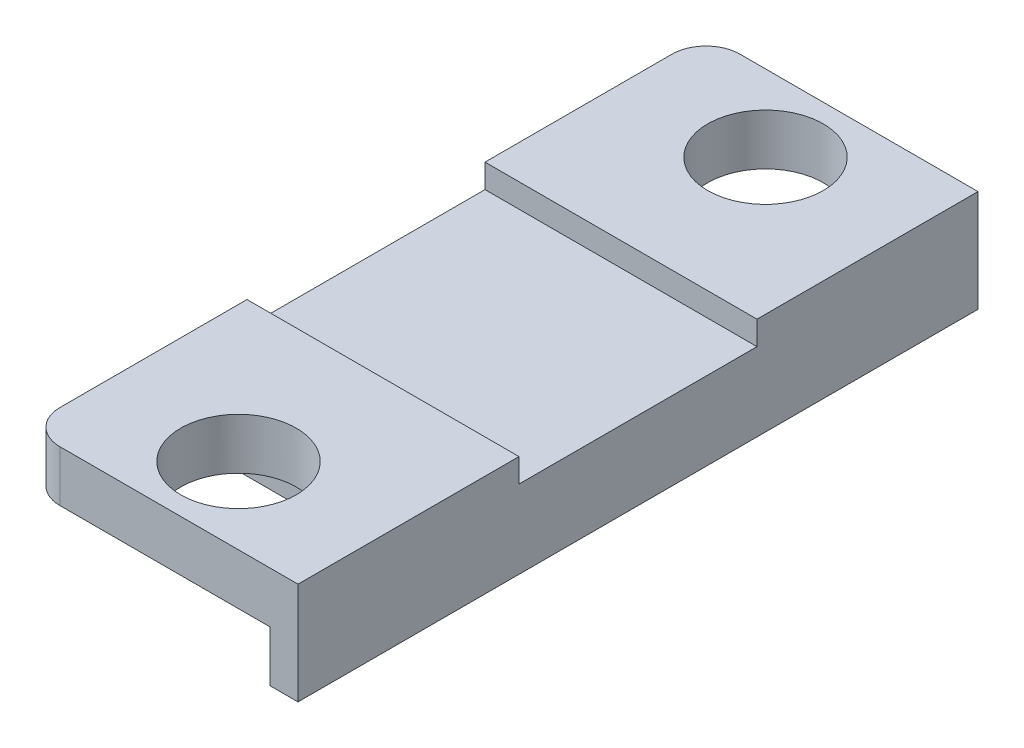
ISO-10303-21;
HEADER;
FILE_DESCRIPTION(('STEP AP214'),'2;1');
FILE_NAME('part.step','',(''),(''),'','','');
FILE_SCHEMA(('AUTOMOTIVE_DESIGN { 1 0 10303 214 1 1 1 1 }'));
ENDSEC;
DATA;
#1=APPLICATION_CONTEXT('core data for automotive mechanical design processes');
#2=APPLICATION_PROTOCOL_DEFINITION('international standard','automotive_design',2000,#1);
#3=PRODUCT_CONTEXT('',#1,'mechanical');
#4=PRODUCT('Part','Part','',(#3));
#5=PRODUCT_RELATED_PRODUCT_CATEGORY('part','',(#4));
#6=PRODUCT_DEFINITION_FORMATION('','',#4);
#7=PRODUCT_DEFINITION_CONTEXT('part definition',#1,'design');
#8=PRODUCT_DEFINITION('design','',#6,#7);
#9=PRODUCT_DEFINITION_SHAPE('','',#8);
#10=(LENGTH_UNIT() NAMED_UNIT(*) SI_UNIT(.MILLI.,.METRE.));
#11=(NAMED_UNIT(*) PLANE_ANGLE_UNIT() SI_UNIT($,.RADIAN.));
#12=(NAMED_UNIT(*) SI_UNIT($,.STERADIAN.) SOLID_ANGLE_UNIT());
#13=UNCERTAINTY_MEASURE_WITH_UNIT(LENGTH_MEASURE(1.E-05),#10,'distance_accuracy_value','');
#14=(GEOMETRIC_REPRESENTATION_CONTEXT(3) GLOBAL_UNCERTAINTY_ASSIGNED_CONTEXT((#13)) GLOBAL_UNIT_ASSIGNED_CONTEXT((#10,
#11,#12)) REPRESENTATION_CONTEXT('',''));
#15=CARTESIAN_POINT('',(0.,0.,0.));
#16=DIRECTION('',(0.,0.,1.));
#17=DIRECTION('',(1.,0.,0.));
#18=AXIS2_PLACEMENT_3D('',#15,#16,#17);
#19=CARTESIAN_POINT('',(169.963302832178,-1.,15.4999987760664));
#20=DIRECTION('',(0.,0.,1.));
#21=DIRECTION('',(1.,0.,0.));
#22=AXIS2_PLACEMENT_3D('',#19,#20,#21);
#23=PLANE('',#22);
#24=DIRECTION('',(1.,0.,0.));
#25=VECTOR('',#24,1.);
#26=CARTESIAN_POINT('',(169.962302832178,-0.7,15.4999987760664));
#27=LINE('',#26,#25);
#28=CARTESIAN_POINT('',(161.962302832178,-0.7,15.4999987760664));
#29=VERTEX_POINT('',#28);
#30=CARTESIAN_POINT('',(169.962302832178,-0.7,15.4999987760664));
#31=VERTEX_POINT('',#30);
#32=EDGE_CURVE('E54',#29,#31,#27,.T.);
#33=ORIENTED_EDGE('',*,*,#32,.F.);
#34=DIRECTION('',(0.,1.,0.));
#35=VECTOR('',#34,1.);
#36=CARTESIAN_POINT('',(161.962302832178,-1.,15.4999987760664));
#37=LINE('',#36,#35);
#38=CARTESIAN_POINT('',(161.962302832178,0.,15.4999987760664));
#39=VERTEX_POINT('',#38);
#40=EDGE_CURVE('E174',#29,#39,#37,.T.);
#41=ORIENTED_EDGE('',*,*,#40,.T.);
#42=DIRECTION('',(-1.,0.,0.));
#43=VECTOR('',#42,1.);
#44=CARTESIAN_POINT('',(169.963302832178,0.,15.4999987760664));
#45=LINE('',#44,#43);
#46=CARTESIAN_POINT('',(169.962302832178,0.,15.4999987760664));
#47=VERTEX_POINT('',#46);
#48=EDGE_CURVE('E173',#47,#39,#45,.T.);
#49=ORIENTED_EDGE('',*,*,#48,.F.);
#50=DIRECTION('',(0.,1.,0.));
#51=VECTOR('',#50,1.);
#52=CARTESIAN_POINT('',(169.962302832178,-1.,15.4999987760664));
#53=LINE('',#52,#51);
#54=EDGE_CURVE('E50',#31,#47,#53,.T.);
#55=ORIENTED_EDGE('',*,*,#54,.F.);
#56=EDGE_LOOP('',(#33,#41,#49,#55));
#57=FACE_BOUND('',#56,.T.);
#58=ADVANCED_FACE('F35',(#57),#23,.F.);
#59=CARTESIAN_POINT('',(169.963302832178,-1.,8.49999877606639));
#60=DIRECTION('',(0.,0.,-1.));
#61=DIRECTION('',(-1.,0.,0.));
#62=AXIS2_PLACEMENT_3D('',#59,#60,#61);
#63=PLANE('',#62);
#64=DIRECTION('',(-1.,0.,0.));
#65=VECTOR('',#64,1.);
#66=CARTESIAN_POINT('',(169.962302832178,-0.7,8.49999877606639));
#67=LINE('',#66,#65);
#68=CARTESIAN_POINT('',(169.962302832178,-0.7,8.49999877606639));
#69=VERTEX_POINT('',#68);
#70=CARTESIAN_POINT('',(161.962302832178,-0.7,8.49999877606639));
#71=VERTEX_POINT('',#70);
#72=EDGE_CURVE('E166',#69,#71,#67,.T.);
#73=ORIENTED_EDGE('',*,*,#72,.F.);
#74=DIRECTION('',(0.,-1.,0.));
#75=VECTOR('',#74,1.);
#76=CARTESIAN_POINT('',(169.962302832178,-1.,8.49999877606639));
#77=LINE('',#76,#75);
#78=CARTESIAN_POINT('',(169.962302832178,0.,8.49999877606639));
#79=VERTEX_POINT('',#78);
#80=EDGE_CURVE('E187',#79,#69,#77,.T.);
#81=ORIENTED_EDGE('',*,*,#80,.F.);
#82=DIRECTION('',(-1.,0.,0.));
#83=VECTOR('',#82,1.);
#84=CARTESIAN_POINT('',(169.963302832178,0.,8.49999877606639));
#85=LINE('',#84,#83);
#86=CARTESIAN_POINT('',(161.962302832178,0.,8.49999877606639));
#87=VERTEX_POINT('',#86);
#88=EDGE_CURVE('E169',#79,#87,#85,.T.);
#89=ORIENTED_EDGE('',*,*,#88,.T.);
#90=DIRECTION('',(0.,-1.,0.));
#91=VECTOR('',#90,1.);
#92=CARTESIAN_POINT('',(161.962302832178,-1.,8.49999877606639));
#93=LINE('',#92,#91);
#94=EDGE_CURVE('E163',#87,#71,#93,.T.);
#95=ORIENTED_EDGE('',*,*,#94,.T.);
#96=EDGE_LOOP('',(#73,#81,#89,#95));
#97=FACE_BOUND('',#96,.T.);
#98=ADVANCED_FACE('F165',(#97),#63,.F.);
#99=CARTESIAN_POINT('',(0.,0.,0.));
#100=DIRECTION('',(0.,1.,0.));
#101=DIRECTION('',(0.,0.,1.));
#102=AXIS2_PLACEMENT_3D('',#99,#100,#101);
#103=PLANE('',#102);
#104=DIRECTION('',(0.,0.,1.));
#105=VECTOR('',#104,1.);
#106=CARTESIAN_POINT('',(161.962302832178,0.,1.99999877606639));
#107=LINE('',#106,#105);
#108=CARTESIAN_POINT('',(161.962302832178,0.,20.9999987760664));
#109=VERTEX_POINT('',#108);
#110=EDGE_CURVE('E267',#39,#109,#107,.T.);
#111=ORIENTED_EDGE('',*,*,#110,.T.);
#112=CARTESIAN_POINT('',(162.962302832178,0.,20.9999987760664));
#113=DIRECTION('',(0.,1.,0.));
#114=DIRECTION('',(0.,0.,1.));
#115=AXIS2_PLACEMENT_3D('',#112,#113,#114);
#116=CIRCLE('',#115,1.);
#117=CARTESIAN_POINT('',(162.962302832178,0.,21.9999987760664));
#118=VERTEX_POINT('',#117);
#119=EDGE_CURVE('E318',#109,#118,#116,.T.);
#120=ORIENTED_EDGE('',*,*,#119,.T.);
#121=DIRECTION('',(1.,0.,0.));
#122=VECTOR('',#121,1.);
#123=CARTESIAN_POINT('',(161.962302832178,0.,21.9999987760664));
#124=LINE('',#123,#122);
#125=CARTESIAN_POINT('',(169.962302832178,0.,21.9999987760664));
#126=VERTEX_POINT('',#125);
#127=EDGE_CURVE('E280',#118,#126,#124,.T.);
#128=ORIENTED_EDGE('',*,*,#127,.T.);
#129=DIRECTION('',(0.,0.,-1.));
#130=VECTOR('',#129,1.);
#131=CARTESIAN_POINT('',(169.962302832178,0.,1.99999877606639));
#132=LINE('',#131,#130);
#133=EDGE_CURVE('E283',#126,#47,#132,.T.);
#134=ORIENTED_EDGE('',*,*,#133,.T.);
#135=ORIENTED_EDGE('',*,*,#48,.T.);
#136=EDGE_LOOP('',(#111,#120,#128,#134,#135));
#137=FACE_BOUND('',#136,.T.);
#138=CARTESIAN_POINT('',(165.962302832178,0.,19.75));
#139=DIRECTION('',(0.,1.,0.));
#140=DIRECTION('',(0.,0.,1.));
#141=AXIS2_PLACEMENT_3D('',#138,#139,#140);
#142=CIRCLE('',#141,1.70000000000001);
#143=CARTESIAN_POINT('',(165.962302832178,0.,21.45));
#144=VERTEX_POINT('',#143);
#145=EDGE_CURVE('E261',#144,#144,#142,.T.);
#146=ORIENTED_EDGE('',*,*,#145,.F.);
#147=EDGE_LOOP('',(#146));
#148=FACE_BOUND('',#147,.T.);
#149=ADVANCED_FACE('F335',(#137,#148),#103,.T.);
#150=CARTESIAN_POINT('',(165.962302832178,-3.,19.75));
#151=DIRECTION('',(0.,1.,0.));
#152=DIRECTION('',(0.,0.,1.));
#153=AXIS2_PLACEMENT_3D('',#150,#151,#152);
#154=CYLINDRICAL_SURFACE('',#153,1.70000000000001);
#155=ORIENTED_EDGE('',*,*,#145,.T.);
#156=EDGE_LOOP('',(#155));
#157=FACE_BOUND('',#156,.T.);
#158=CARTESIAN_POINT('',(165.962302832178,-1.5,19.75));
#159=DIRECTION('',(0.,-1.,0.));
#160=DIRECTION('',(0.,0.,-1.));
#161=AXIS2_PLACEMENT_3D('',#158,#159,#160);
#162=CIRCLE('',#161,1.70000000000001);
#163=CARTESIAN_POINT('',(165.962302832178,-1.5,18.05));
#164=VERTEX_POINT('',#163);
#165=EDGE_CURVE('E253',#164,#164,#162,.F.);
#166=ORIENTED_EDGE('',*,*,#165,.F.);
#167=EDGE_LOOP('',(#166));
#168=FACE_BOUND('',#167,.T.);
#169=ADVANCED_FACE('F378',(#157,#168),#154,.F.);
#170=CARTESIAN_POINT('',(161.962302832178,-3.,1.99999877606639));
#171=DIRECTION('',(-1.,0.,0.));
#172=DIRECTION('',(0.,0.,1.));
#173=AXIS2_PLACEMENT_3D('',#170,#171,#172);
#174=PLANE('',#173);
#175=ORIENTED_EDGE('',*,*,#40,.F.);
#176=DIRECTION('',(0.,0.,1.));
#177=VECTOR('',#176,1.);
#178=CARTESIAN_POINT('',(161.962302832178,-0.7,8.49999877606639));
#179=LINE('',#178,#177);
#180=EDGE_CURVE('E180',#71,#29,#179,.T.);
#181=ORIENTED_EDGE('',*,*,#180,.F.);
#182=ORIENTED_EDGE('',*,*,#94,.F.);
#183=CARTESIAN_POINT('',(161.962302832178,0.,2.99999877606639));
#184=VERTEX_POINT('',#183);
#185=EDGE_CURVE('E278',#184,#87,#107,.T.);
#186=ORIENTED_EDGE('',*,*,#185,.F.);
#187=DIRECTION('',(0.,1.,0.));
#188=VECTOR('',#187,1.);
#189=CARTESIAN_POINT('',(161.962302832178,-3.,2.99999877606639));
#190=LINE('',#189,#188);
#191=CARTESIAN_POINT('',(161.962302832178,-1.5,2.99999877606639));
#192=VERTEX_POINT('',#191);
#193=EDGE_CURVE('E300',#184,#192,#190,.F.);
#194=ORIENTED_EDGE('',*,*,#193,.T.);
#195=DIRECTION('',(0.,0.,-1.));
#196=VECTOR('',#195,1.);
#197=CARTESIAN_POINT('',(161.962302832178,-1.5,1.99999877606639));
#198=LINE('',#197,#196);
#199=CARTESIAN_POINT('',(161.962302832178,-1.5,6.99999755213277));
#200=VERTEX_POINT('',#199);
#201=EDGE_CURVE('E204',#200,#192,#198,.T.);
#202=ORIENTED_EDGE('',*,*,#201,.F.);
#203=DIRECTION('',(0.,-1.,0.));
#204=VECTOR('',#203,1.);
#205=CARTESIAN_POINT('',(161.962302832178,-1.5,6.99999755213277));
#206=LINE('',#205,#204);
#207=CARTESIAN_POINT('',(161.962302832178,-2.,6.99999755213277));
#208=VERTEX_POINT('',#207);
#209=EDGE_CURVE('E224',#200,#208,#206,.T.);
#210=ORIENTED_EDGE('',*,*,#209,.T.);
#211=DIRECTION('',(0.,0.,1.));
#212=VECTOR('',#211,1.);
#213=CARTESIAN_POINT('',(161.962302832178,-2.,17.));
#214=LINE('',#213,#212);
#215=CARTESIAN_POINT('',(161.962302832178,-2.,17.));
#216=VERTEX_POINT('',#215);
#217=EDGE_CURVE('E302',#208,#216,#214,.T.);
#218=ORIENTED_EDGE('',*,*,#217,.T.);
#219=DIRECTION('',(0.,-1.,0.));
#220=VECTOR('',#219,1.);
#221=CARTESIAN_POINT('',(161.962302832178,-1.5,17.));
#222=LINE('',#221,#220);
#223=CARTESIAN_POINT('',(161.962302832178,-1.5,17.));
#224=VERTEX_POINT('',#223);
#225=EDGE_CURVE('E250',#224,#216,#222,.T.);
#226=ORIENTED_EDGE('',*,*,#225,.F.);
#227=DIRECTION('',(0.,0.,-1.));
#228=VECTOR('',#227,1.);
#229=CARTESIAN_POINT('',(161.962302832178,-1.5,21.9999987760664));
#230=LINE('',#229,#228);
#231=CARTESIAN_POINT('',(161.962302832178,-1.5,20.9999987760664));
#232=VERTEX_POINT('',#231);
#233=EDGE_CURVE('E241',#232,#224,#230,.T.);
#234=ORIENTED_EDGE('',*,*,#233,.F.);
#235=DIRECTION('',(0.,1.,0.));
#236=VECTOR('',#235,1.);
#237=CARTESIAN_POINT('',(161.962302832178,-3.,20.9999987760664));
#238=LINE('',#237,#236);
#239=EDGE_CURVE('E291',#232,#109,#238,.T.);
#240=ORIENTED_EDGE('',*,*,#239,.T.);
#241=ORIENTED_EDGE('',*,*,#110,.F.);
#242=EDGE_LOOP('',(#175,#181,#182,#186,#194,#202,#210,#218,#226,#234,#240,#241));
#243=FACE_BOUND('',#242,.T.);
#244=ADVANCED_FACE('F184',(#243),#174,.T.);
#245=CARTESIAN_POINT('',(161.962302832178,-3.,1.99999877606639));
#246=DIRECTION('',(0.,0.,-1.));
#247=DIRECTION('',(-1.,0.,0.));
#248=AXIS2_PLACEMENT_3D('',#245,#246,#247);
#249=PLANE('',#248);
#250=DIRECTION('',(1.,0.,0.));
#251=VECTOR('',#250,1.);
#252=CARTESIAN_POINT('',(169.137729312721,-1.5,1.99999877606639));
#253=LINE('',#252,#251);
#254=CARTESIAN_POINT('',(162.962302832178,-1.5,1.99999877606639));
#255=VERTEX_POINT('',#254);
#256=CARTESIAN_POINT('',(169.137729312721,-1.5,1.99999877606639));
#257=VERTEX_POINT('',#256);
#258=EDGE_CURVE('E207',#255,#257,#253,.T.);
#259=ORIENTED_EDGE('',*,*,#258,.F.);
#260=DIRECTION('',(0.,1.,0.));
#261=VECTOR('',#260,1.);
#262=CARTESIAN_POINT('',(162.962302832178,-3.,1.99999877606639));
#263=LINE('',#262,#261);
#264=CARTESIAN_POINT('',(162.962302832178,0.,1.99999877606639));
#265=VERTEX_POINT('',#264);
#266=EDGE_CURVE('E311',#255,#265,#263,.T.);
#267=ORIENTED_EDGE('',*,*,#266,.T.);
#268=DIRECTION('',(-1.,0.,0.));
#269=VECTOR('',#268,1.);
#270=CARTESIAN_POINT('',(161.962302832178,0.,1.99999877606639));
#271=LINE('',#270,#269);
#272=CARTESIAN_POINT('',(169.962302832178,0.,1.99999877606639));
#273=VERTEX_POINT('',#272);
#274=EDGE_CURVE('E271',#273,#265,#271,.T.);
#275=ORIENTED_EDGE('',*,*,#274,.F.);
#276=DIRECTION('',(0.,1.,0.));
#277=VECTOR('',#276,1.);
#278=CARTESIAN_POINT('',(169.962302832178,-3.,1.99999877606639));
#279=LINE('',#278,#277);
#280=CARTESIAN_POINT('',(169.962302832178,-3.,1.99999877606639));
#281=VERTEX_POINT('',#280);
#282=EDGE_CURVE('E288',#281,#273,#279,.T.);
#283=ORIENTED_EDGE('',*,*,#282,.F.);
#284=DIRECTION('',(-1.,0.,0.));
#285=VECTOR('',#284,1.);
#286=CARTESIAN_POINT('',(161.962302832178,-3.,1.99999877606639));
#287=LINE('',#286,#285);
#288=CARTESIAN_POINT('',(169.137729312721,-3.,1.99999877606639));
#289=VERTEX_POINT('',#288);
#290=EDGE_CURVE('E274',#281,#289,#287,.T.);
#291=ORIENTED_EDGE('',*,*,#290,.T.);
#292=DIRECTION('',(0.,-1.,0.));
#293=VECTOR('',#292,1.);
#294=CARTESIAN_POINT('',(169.137729312721,-1.5,1.99999877606639));
#295=LINE('',#294,#293);
#296=EDGE_CURVE('E222',#257,#289,#295,.T.);
#297=ORIENTED_EDGE('',*,*,#296,.F.);
#298=EDGE_LOOP('',(#259,#267,#275,#283,#291,#297));
#299=FACE_BOUND('',#298,.T.);
#300=ADVANCED_FACE('F393',(#299),#249,.T.);
#301=CARTESIAN_POINT('',(169.962302832178,-3.,1.99999877606639));
#302=DIRECTION('',(1.,0.,0.));
#303=DIRECTION('',(0.,0.,-1.));
#304=AXIS2_PLACEMENT_3D('',#301,#302,#303);
#305=PLANE('',#304);
#306=DIRECTION('',(0.,0.,-1.));
#307=VECTOR('',#306,1.);
#308=CARTESIAN_POINT('',(169.962302832178,-0.7,8.49999877606639));
#309=LINE('',#308,#307);
#310=EDGE_CURVE('E182',#31,#69,#309,.T.);
#311=ORIENTED_EDGE('',*,*,#310,.F.);
#312=ORIENTED_EDGE('',*,*,#54,.T.);
#313=ORIENTED_EDGE('',*,*,#133,.F.);
#314=DIRECTION('',(0.,1.,0.));
#315=VECTOR('',#314,1.);
#316=CARTESIAN_POINT('',(169.962302832178,-3.,21.9999987760664));
#317=LINE('',#316,#315);
#318=CARTESIAN_POINT('',(169.962302832178,-3.,21.9999987760664));
#319=VERTEX_POINT('',#318);
#320=EDGE_CURVE('E277',#319,#126,#317,.T.);
#321=ORIENTED_EDGE('',*,*,#320,.F.);
#322=DIRECTION('',(0.,0.,-1.));
#323=VECTOR('',#322,1.);
#324=CARTESIAN_POINT('',(169.962302832178,-3.,1.99999877606639));
#325=LINE('',#324,#323);
#326=EDGE_CURVE('E270',#319,#281,#325,.T.);
#327=ORIENTED_EDGE('',*,*,#326,.T.);
#328=ORIENTED_EDGE('',*,*,#282,.T.);
#329=EDGE_CURVE('E282',#79,#273,#132,.T.);
#330=ORIENTED_EDGE('',*,*,#329,.F.);
#331=ORIENTED_EDGE('',*,*,#80,.T.);
#332=EDGE_LOOP('',(#311,#312,#313,#321,#327,#328,#330,#331));
#333=FACE_BOUND('',#332,.T.);
#334=ADVANCED_FACE('F396',(#333),#305,.T.);
#335=CARTESIAN_POINT('',(161.962302832178,-3.,21.9999987760664));
#336=DIRECTION('',(0.,0.,1.));
#337=DIRECTION('',(1.,0.,0.));
#338=AXIS2_PLACEMENT_3D('',#335,#336,#337);
#339=PLANE('',#338);
#340=ORIENTED_EDGE('',*,*,#127,.F.);
#341=DIRECTION('',(0.,1.,0.));
#342=VECTOR('',#341,1.);
#343=CARTESIAN_POINT('',(162.962302832178,-3.,21.9999987760664));
#344=LINE('',#343,#342);
#345=CARTESIAN_POINT('',(162.962302832178,-1.5,21.9999987760664));
#346=VERTEX_POINT('',#345);
#347=EDGE_CURVE('E43',#118,#346,#344,.F.);
#348=ORIENTED_EDGE('',*,*,#347,.T.);
#349=DIRECTION('',(-1.,0.,0.));
#350=VECTOR('',#349,1.);
#351=CARTESIAN_POINT('',(169.137729312721,-1.5,21.9999987760664));
#352=LINE('',#351,#350);
#353=CARTESIAN_POINT('',(169.137729312721,-1.5,21.9999987760664));
#354=VERTEX_POINT('',#353);
#355=EDGE_CURVE('E238',#354,#346,#352,.T.);
#356=ORIENTED_EDGE('',*,*,#355,.F.);
#357=DIRECTION('',(0.,-1.,0.));
#358=VECTOR('',#357,1.);
#359=CARTESIAN_POINT('',(169.137729312721,-1.5,21.9999987760664));
#360=LINE('',#359,#358);
#361=CARTESIAN_POINT('',(169.137729312721,-3.,21.9999987760664));
#362=VERTEX_POINT('',#361);
#363=EDGE_CURVE('E254',#354,#362,#360,.T.);
#364=ORIENTED_EDGE('',*,*,#363,.T.);
#365=DIRECTION('',(1.,0.,0.));
#366=VECTOR('',#365,1.);
#367=CARTESIAN_POINT('',(161.962302832178,-3.,21.9999987760664));
#368=LINE('',#367,#366);
#369=EDGE_CURVE('E268',#362,#319,#368,.T.);
#370=ORIENTED_EDGE('',*,*,#369,.T.);
#371=ORIENTED_EDGE('',*,*,#320,.T.);
#372=EDGE_LOOP('',(#340,#348,#356,#364,#370,#371));
#373=FACE_BOUND('',#372,.T.);
#374=ADVANCED_FACE('F323',(#373),#339,.T.);
#375=CARTESIAN_POINT('',(0.,-3.,0.));
#376=DIRECTION('',(0.,1.,0.));
#377=DIRECTION('',(0.,0.,1.));
#378=AXIS2_PLACEMENT_3D('',#375,#376,#377);
#379=PLANE('',#378);
#380=DIRECTION('',(1.,0.,0.));
#381=VECTOR('',#380,1.);
#382=CARTESIAN_POINT('',(164.374589591906,-3.,17.));
#383=LINE('',#382,#381);
#384=CARTESIAN_POINT('',(162.962302832178,-3.,17.));
#385=VERTEX_POINT('',#384);
#386=CARTESIAN_POINT('',(167.550016072449,-3.,17.));
#387=VERTEX_POINT('',#386);
#388=EDGE_CURVE('E244',#385,#387,#383,.T.);
#389=ORIENTED_EDGE('',*,*,#388,.F.);
#390=DIRECTION('',(0.,0.,1.));
#391=VECTOR('',#390,1.);
#392=CARTESIAN_POINT('',(162.962302832178,-3.,6.99999755213277));
#393=LINE('',#392,#391);
#394=CARTESIAN_POINT('',(162.962302832178,-3.,6.99999755213277));
#395=VERTEX_POINT('',#394);
#396=EDGE_CURVE('E307',#385,#395,#393,.F.);
#397=ORIENTED_EDGE('',*,*,#396,.T.);
#398=DIRECTION('',(-1.,0.,0.));
#399=VECTOR('',#398,1.);
#400=CARTESIAN_POINT('',(161.962302832178,-3.,6.99999755213277));
#401=LINE('',#400,#399);
#402=CARTESIAN_POINT('',(167.550016072449,-3.,6.99999755213277));
#403=VERTEX_POINT('',#402);
#404=EDGE_CURVE('E214',#403,#395,#401,.T.);
#405=ORIENTED_EDGE('',*,*,#404,.F.);
#406=DIRECTION('',(-0.500000000000003,0.,0.866025403784437));
#407=VECTOR('',#406,1.);
#408=CARTESIAN_POINT('',(167.550016072449,-3.,6.99999755213277));
#409=LINE('',#408,#407);
#410=CARTESIAN_POINT('',(169.137729312721,-3.,4.24999755213281));
#411=VERTEX_POINT('',#410);
#412=EDGE_CURVE('E195',#411,#403,#409,.T.);
#413=ORIENTED_EDGE('',*,*,#412,.F.);
#414=DIRECTION('',(0.,0.,1.));
#415=VECTOR('',#414,1.);
#416=CARTESIAN_POINT('',(169.137729312721,-3.,4.24999755213281));
#417=LINE('',#416,#415);
#418=EDGE_CURVE('E202',#289,#411,#417,.T.);
#419=ORIENTED_EDGE('',*,*,#418,.F.);
#420=ORIENTED_EDGE('',*,*,#290,.F.);
#421=ORIENTED_EDGE('',*,*,#326,.F.);
#422=ORIENTED_EDGE('',*,*,#369,.F.);
#423=DIRECTION('',(0.,0.,1.));
#424=VECTOR('',#423,1.);
#425=CARTESIAN_POINT('',(169.137729312721,-3.,19.75));
#426=LINE('',#425,#424);
#427=CARTESIAN_POINT('',(169.137729312721,-3.,19.75));
#428=VERTEX_POINT('',#427);
#429=EDGE_CURVE('E232',#428,#362,#426,.T.);
#430=ORIENTED_EDGE('',*,*,#429,.F.);
#431=DIRECTION('',(0.500000000000003,0.,0.866025403784437));
#432=VECTOR('',#431,1.);
#433=CARTESIAN_POINT('',(167.550016072449,-3.,17.));
#434=LINE('',#433,#432);
#435=EDGE_CURVE('E246',#387,#428,#434,.T.);
#436=ORIENTED_EDGE('',*,*,#435,.F.);
#437=EDGE_LOOP('',(#389,#397,#405,#413,#419,#420,#421,#422,#430,#436));
#438=FACE_BOUND('',#437,.T.);
#439=ADVANCED_FACE('F386',(#438),#379,.F.);
#440=ORIENTED_EDGE('',*,*,#274,.T.);
#441=CARTESIAN_POINT('',(162.962302832178,0.,2.99999877606639));
#442=DIRECTION('',(0.,1.,0.));
#443=DIRECTION('',(0.,0.,1.));
#444=AXIS2_PLACEMENT_3D('',#441,#442,#443);
#445=CIRCLE('',#444,1.);
#446=EDGE_CURVE('E314',#265,#184,#445,.T.);
#447=ORIENTED_EDGE('',*,*,#446,.T.);
#448=ORIENTED_EDGE('',*,*,#185,.T.);
#449=ORIENTED_EDGE('',*,*,#88,.F.);
#450=ORIENTED_EDGE('',*,*,#329,.T.);
#451=EDGE_LOOP('',(#440,#447,#448,#449,#450));
#452=FACE_BOUND('',#451,.T.);
#453=CARTESIAN_POINT('',(165.962302832178,0.,4.24999877606638));
#454=DIRECTION('',(0.,1.,0.));
#455=DIRECTION('',(0.,0.,1.));
#456=AXIS2_PLACEMENT_3D('',#453,#454,#455);
#457=CIRCLE('',#456,1.70000000000001);
#458=CARTESIAN_POINT('',(165.962302832178,0.,5.94999877606639));
#459=VERTEX_POINT('',#458);
#460=EDGE_CURVE('E264',#459,#459,#457,.T.);
#461=ORIENTED_EDGE('',*,*,#460,.F.);
#462=EDGE_LOOP('',(#461));
#463=FACE_BOUND('',#462,.T.);
#464=ADVANCED_FACE('F384',(#452,#463),#103,.T.);
#465=CARTESIAN_POINT('',(165.962302832178,-3.,4.24999877606638));
#466=DIRECTION('',(0.,1.,0.));
#467=DIRECTION('',(0.,0.,1.));
#468=AXIS2_PLACEMENT_3D('',#465,#466,#467);
#469=CYLINDRICAL_SURFACE('',#468,1.70000000000001);
#470=CARTESIAN_POINT('',(165.962302832178,-1.5,4.24999877606638));
#471=DIRECTION('',(0.,1.,0.));
#472=DIRECTION('',(0.,0.,1.));
#473=AXIS2_PLACEMENT_3D('',#470,#471,#472);
#474=CIRCLE('',#473,1.70000000000001);
#475=CARTESIAN_POINT('',(165.962302832178,-1.5,5.94999877606639));
#476=VERTEX_POINT('',#475);
#477=EDGE_CURVE('E221',#476,#476,#474,.F.);
#478=ORIENTED_EDGE('',*,*,#477,.T.);
#479=EDGE_LOOP('',(#478));
#480=FACE_BOUND('',#479,.T.);
#481=ORIENTED_EDGE('',*,*,#460,.T.);
#482=EDGE_LOOP('',(#481));
#483=FACE_BOUND('',#482,.T.);
#484=ADVANCED_FACE('F367',(#480,#483),#469,.F.);
#485=CARTESIAN_POINT('',(0.,-1.5,0.));
#486=DIRECTION('',(0.,-1.,0.));
#487=DIRECTION('',(0.,0.,-1.));
#488=AXIS2_PLACEMENT_3D('',#485,#486,#487);
#489=PLANE('',#488);
#490=ORIENTED_EDGE('',*,*,#355,.T.);
#491=CARTESIAN_POINT('',(162.962302832178,-1.5,20.9999987760664));
#492=DIRECTION('',(0.,-1.,0.));
#493=DIRECTION('',(0.,0.,-1.));
#494=AXIS2_PLACEMENT_3D('',#491,#492,#493);
#495=CIRCLE('',#494,1.);
#496=EDGE_CURVE('E11',#346,#232,#495,.T.);
#497=ORIENTED_EDGE('',*,*,#496,.T.);
#498=ORIENTED_EDGE('',*,*,#233,.T.);
#499=DIRECTION('',(1.,0.,0.));
#500=VECTOR('',#499,1.);
#501=CARTESIAN_POINT('',(161.962302832178,-1.5,17.));
#502=LINE('',#501,#500);
#503=CARTESIAN_POINT('',(167.550016072449,-1.5,17.));
#504=VERTEX_POINT('',#503);
#505=EDGE_CURVE('E229',#224,#504,#502,.T.);
#506=ORIENTED_EDGE('',*,*,#505,.T.);
#507=DIRECTION('',(0.500000000000003,0.,0.866025403784437));
#508=VECTOR('',#507,1.);
#509=CARTESIAN_POINT('',(167.550016072449,-1.5,17.));
#510=LINE('',#509,#508);
#511=CARTESIAN_POINT('',(169.137729312721,-1.5,19.75));
#512=VERTEX_POINT('',#511);
#513=EDGE_CURVE('E231',#504,#512,#510,.T.);
#514=ORIENTED_EDGE('',*,*,#513,.T.);
#515=DIRECTION('',(0.,0.,1.));
#516=VECTOR('',#515,1.);
#517=CARTESIAN_POINT('',(169.137729312721,-1.5,19.75));
#518=LINE('',#517,#516);
#519=EDGE_CURVE('E235',#512,#354,#518,.T.);
#520=ORIENTED_EDGE('',*,*,#519,.T.);
#521=EDGE_LOOP('',(#490,#497,#498,#506,#514,#520));
#522=FACE_BOUND('',#521,.T.);
#523=ORIENTED_EDGE('',*,*,#165,.T.);
#524=EDGE_LOOP('',(#523));
#525=FACE_BOUND('',#524,.T.);
#526=ADVANCED_FACE('F327',(#522,#525),#489,.T.);
#527=CARTESIAN_POINT('',(169.137729312721,-1.5,19.75));
#528=DIRECTION('',(1.,0.,0.));
#529=DIRECTION('',(0.,0.,-1.));
#530=AXIS2_PLACEMENT_3D('',#527,#528,#529);
#531=PLANE('',#530);
#532=ORIENTED_EDGE('',*,*,#429,.T.);
#533=ORIENTED_EDGE('',*,*,#363,.F.);
#534=ORIENTED_EDGE('',*,*,#519,.F.);
#535=DIRECTION('',(0.,-1.,0.));
#536=VECTOR('',#535,1.);
#537=CARTESIAN_POINT('',(169.137729312721,-1.5,19.75));
#538=LINE('',#537,#536);
#539=EDGE_CURVE('E257',#512,#428,#538,.T.);
#540=ORIENTED_EDGE('',*,*,#539,.T.);
#541=EDGE_LOOP('',(#532,#533,#534,#540));
#542=FACE_BOUND('',#541,.T.);
#543=ADVANCED_FACE('F366',(#542),#531,.F.);
#544=CARTESIAN_POINT('',(167.550016072449,-1.5,17.));
#545=DIRECTION('',(0.866025403784437,0.,-0.500000000000003));
#546=DIRECTION('',(-0.500000000000003,0.,-0.866025403784437));
#547=AXIS2_PLACEMENT_3D('',#544,#545,#546);
#548=PLANE('',#547);
#549=ORIENTED_EDGE('',*,*,#435,.T.);
#550=ORIENTED_EDGE('',*,*,#539,.F.);
#551=ORIENTED_EDGE('',*,*,#513,.F.);
#552=DIRECTION('',(0.,-1.,0.));
#553=VECTOR('',#552,1.);
#554=CARTESIAN_POINT('',(167.550016072449,-1.5,17.));
#555=LINE('',#554,#553);
#556=EDGE_CURVE('E243',#504,#387,#555,.T.);
#557=ORIENTED_EDGE('',*,*,#556,.T.);
#558=EDGE_LOOP('',(#549,#550,#551,#557));
#559=FACE_BOUND('',#558,.T.);
#560=ADVANCED_FACE('F370',(#559),#548,.F.);
#561=CARTESIAN_POINT('',(164.374589591906,-1.5,17.));
#562=DIRECTION('',(0.,0.,-1.));
#563=DIRECTION('',(-1.,0.,0.));
#564=AXIS2_PLACEMENT_3D('',#561,#562,#563);
#565=PLANE('',#564);
#566=ORIENTED_EDGE('',*,*,#225,.T.);
#567=CARTESIAN_POINT('',(162.962302832178,-2.,17.));
#568=DIRECTION('',(0.,0.,-1.));
#569=DIRECTION('',(-1.,0.,0.));
#570=AXIS2_PLACEMENT_3D('',#567,#568,#569);
#571=CIRCLE('',#570,1.);
#572=EDGE_CURVE('E305',#216,#385,#571,.F.);
#573=ORIENTED_EDGE('',*,*,#572,.T.);
#574=ORIENTED_EDGE('',*,*,#388,.T.);
#575=ORIENTED_EDGE('',*,*,#556,.F.);
#576=ORIENTED_EDGE('',*,*,#505,.F.);
#577=EDGE_LOOP('',(#566,#573,#574,#575,#576));
#578=FACE_BOUND('',#577,.T.);
#579=ADVANCED_FACE('F350',(#578),#565,.F.);
#580=CARTESIAN_POINT('',(0.,-1.5,0.));
#581=DIRECTION('',(0.,1.,0.));
#582=DIRECTION('',(0.,0.,1.));
#583=AXIS2_PLACEMENT_3D('',#580,#581,#582);
#584=PLANE('',#583);
#585=ORIENTED_EDGE('',*,*,#201,.T.);
#586=CARTESIAN_POINT('',(162.962302832178,-1.5,2.99999877606639));
#587=DIRECTION('',(0.,1.,0.));
#588=DIRECTION('',(0.,0.,1.));
#589=AXIS2_PLACEMENT_3D('',#586,#587,#588);
#590=CIRCLE('',#589,1.);
#591=EDGE_CURVE('E316',#192,#255,#590,.F.);
#592=ORIENTED_EDGE('',*,*,#591,.T.);
#593=ORIENTED_EDGE('',*,*,#258,.T.);
#594=DIRECTION('',(0.,0.,1.));
#595=VECTOR('',#594,1.);
#596=CARTESIAN_POINT('',(169.137729312721,-1.5,4.24999755213281));
#597=LINE('',#596,#595);
#598=CARTESIAN_POINT('',(169.137729312721,-1.5,4.24999755213281));
#599=VERTEX_POINT('',#598);
#600=EDGE_CURVE('E209',#257,#599,#597,.T.);
#601=ORIENTED_EDGE('',*,*,#600,.T.);
#602=DIRECTION('',(-0.500000000000003,0.,0.866025403784437));
#603=VECTOR('',#602,1.);
#604=CARTESIAN_POINT('',(167.550016072449,-1.5,6.99999755213277));
#605=LINE('',#604,#603);
#606=CARTESIAN_POINT('',(167.550016072449,-1.5,6.99999755213277));
#607=VERTEX_POINT('',#606);
#608=EDGE_CURVE('E198',#599,#607,#605,.T.);
#609=ORIENTED_EDGE('',*,*,#608,.T.);
#610=DIRECTION('',(-1.,0.,0.));
#611=VECTOR('',#610,1.);
#612=CARTESIAN_POINT('',(164.374589591906,-1.5,6.99999755213277));
#613=LINE('',#612,#611);
#614=EDGE_CURVE('E201',#607,#200,#613,.T.);
#615=ORIENTED_EDGE('',*,*,#614,.T.);
#616=EDGE_LOOP('',(#585,#592,#593,#601,#609,#615));
#617=FACE_BOUND('',#616,.T.);
#618=ORIENTED_EDGE('',*,*,#477,.F.);
#619=EDGE_LOOP('',(#618));
#620=FACE_BOUND('',#619,.T.);
#621=ADVANCED_FACE('F346',(#617,#620),#584,.F.);
#622=CARTESIAN_POINT('',(167.550016072449,-1.5,6.99999755213277));
#623=DIRECTION('',(0.866025403784437,0.,0.500000000000003));
#624=DIRECTION('',(0.500000000000003,0.,-0.866025403784437));
#625=AXIS2_PLACEMENT_3D('',#622,#623,#624);
#626=PLANE('',#625);
#627=ORIENTED_EDGE('',*,*,#412,.T.);
#628=DIRECTION('',(0.,-1.,0.));
#629=VECTOR('',#628,1.);
#630=CARTESIAN_POINT('',(167.550016072449,-1.5,6.99999755213277));
#631=LINE('',#630,#629);
#632=EDGE_CURVE('E212',#607,#403,#631,.T.);
#633=ORIENTED_EDGE('',*,*,#632,.F.);
#634=ORIENTED_EDGE('',*,*,#608,.F.);
#635=DIRECTION('',(0.,-1.,0.));
#636=VECTOR('',#635,1.);
#637=CARTESIAN_POINT('',(169.137729312721,-1.5,4.24999755213281));
#638=LINE('',#637,#636);
#639=EDGE_CURVE('E219',#599,#411,#638,.T.);
#640=ORIENTED_EDGE('',*,*,#639,.T.);
#641=EDGE_LOOP('',(#627,#633,#634,#640));
#642=FACE_BOUND('',#641,.T.);
#643=ADVANCED_FACE('F349',(#642),#626,.F.);
#644=CARTESIAN_POINT('',(169.137729312721,-1.5,4.24999755213281));
#645=DIRECTION('',(1.,0.,0.));
#646=DIRECTION('',(0.,0.,-1.));
#647=AXIS2_PLACEMENT_3D('',#644,#645,#646);
#648=PLANE('',#647);
#649=ORIENTED_EDGE('',*,*,#418,.T.);
#650=ORIENTED_EDGE('',*,*,#639,.F.);
#651=ORIENTED_EDGE('',*,*,#600,.F.);
#652=ORIENTED_EDGE('',*,*,#296,.T.);
#653=EDGE_LOOP('',(#649,#650,#651,#652));
#654=FACE_BOUND('',#653,.T.);
#655=ADVANCED_FACE('F352',(#654),#648,.F.);
#656=CARTESIAN_POINT('',(161.962302832178,-1.5,6.99999755213277));
#657=DIRECTION('',(0.,0.,1.));
#658=DIRECTION('',(1.,0.,0.));
#659=AXIS2_PLACEMENT_3D('',#656,#657,#658);
#660=PLANE('',#659);
#661=ORIENTED_EDGE('',*,*,#404,.T.);
#662=CARTESIAN_POINT('',(162.962302832178,-2.,6.99999755213277));
#663=DIRECTION('',(0.,0.,1.));
#664=DIRECTION('',(1.,0.,0.));
#665=AXIS2_PLACEMENT_3D('',#662,#663,#664);
#666=CIRCLE('',#665,1.);
#667=EDGE_CURVE('E309',#395,#208,#666,.F.);
#668=ORIENTED_EDGE('',*,*,#667,.T.);
#669=ORIENTED_EDGE('',*,*,#209,.F.);
#670=ORIENTED_EDGE('',*,*,#614,.F.);
#671=ORIENTED_EDGE('',*,*,#632,.T.);
#672=EDGE_LOOP('',(#661,#668,#669,#670,#671));
#673=FACE_BOUND('',#672,.T.);
#674=ADVANCED_FACE('F355',(#673),#660,.F.);
#675=CARTESIAN_POINT('',(162.962302832178,-2.,1.99999877606639));
#676=DIRECTION('',(0.,0.,-1.));
#677=DIRECTION('',(-1.,0.,0.));
#678=AXIS2_PLACEMENT_3D('',#675,#676,#677);
#679=CYLINDRICAL_SURFACE('',#678,1.);
#680=ORIENTED_EDGE('',*,*,#667,.F.);
#681=ORIENTED_EDGE('',*,*,#396,.F.);
#682=ORIENTED_EDGE('',*,*,#572,.F.);
#683=ORIENTED_EDGE('',*,*,#217,.F.);
#684=EDGE_LOOP('',(#680,#681,#682,#683));
#685=FACE_BOUND('',#684,.T.);
#686=ADVANCED_FACE('F359',(#685),#679,.T.);
#687=CARTESIAN_POINT('',(162.962302832178,-3.,2.99999877606639));
#688=DIRECTION('',(0.,1.,0.));
#689=DIRECTION('',(0.,0.,1.));
#690=AXIS2_PLACEMENT_3D('',#687,#688,#689);
#691=CYLINDRICAL_SURFACE('',#690,1.);
#692=ORIENTED_EDGE('',*,*,#591,.F.);
#693=ORIENTED_EDGE('',*,*,#193,.F.);
#694=ORIENTED_EDGE('',*,*,#446,.F.);
#695=ORIENTED_EDGE('',*,*,#266,.F.);
#696=EDGE_LOOP('',(#692,#693,#694,#695));
#697=FACE_BOUND('',#696,.T.);
#698=ADVANCED_FACE('F406',(#697),#691,.T.);
#699=CARTESIAN_POINT('',(162.962302832178,-3.,20.9999987760664));
#700=DIRECTION('',(0.,1.,0.));
#701=DIRECTION('',(0.,0.,1.));
#702=AXIS2_PLACEMENT_3D('',#699,#700,#701);
#703=CYLINDRICAL_SURFACE('',#702,1.);
#704=ORIENTED_EDGE('',*,*,#496,.F.);
#705=ORIENTED_EDGE('',*,*,#347,.F.);
#706=ORIENTED_EDGE('',*,*,#119,.F.);
#707=ORIENTED_EDGE('',*,*,#239,.F.);
#708=EDGE_LOOP('',(#704,#705,#706,#707));
#709=FACE_BOUND('',#708,.T.);
#710=ADVANCED_FACE('F37',(#709),#703,.T.);
#711=CARTESIAN_POINT('',(0.,-0.7,0.));
#712=DIRECTION('',(0.,-1.,0.));
#713=DIRECTION('',(0.,0.,-1.));
#714=AXIS2_PLACEMENT_3D('',#711,#712,#713);
#715=PLANE('',#714);
#716=ORIENTED_EDGE('',*,*,#310,.T.);
#717=ORIENTED_EDGE('',*,*,#72,.T.);
#718=ORIENTED_EDGE('',*,*,#180,.T.);
#719=ORIENTED_EDGE('',*,*,#32,.T.);
#720=EDGE_LOOP('',(#716,#717,#718,#719));
#721=FACE_BOUND('',#720,.T.);
#722=ADVANCED_FACE('F179',(#721),#715,.F.);
#723=CLOSED_SHELL('',(#58,#98,#149,#169,#244,#300,#334,#374,#439,#464,#484,#526,#543,#560,#579,
#621,#643,#655,#674,#686,#698,#710,#722));
#724=MANIFOLD_SOLID_BREP('B2',#723);
#725=ADVANCED_BREP_SHAPE_REPRESENTATION('',(#18,#724),#14);
#726=SHAPE_DEFINITION_REPRESENTATION(#9,#725);
ENDSEC;
END-ISO-10303-21;
